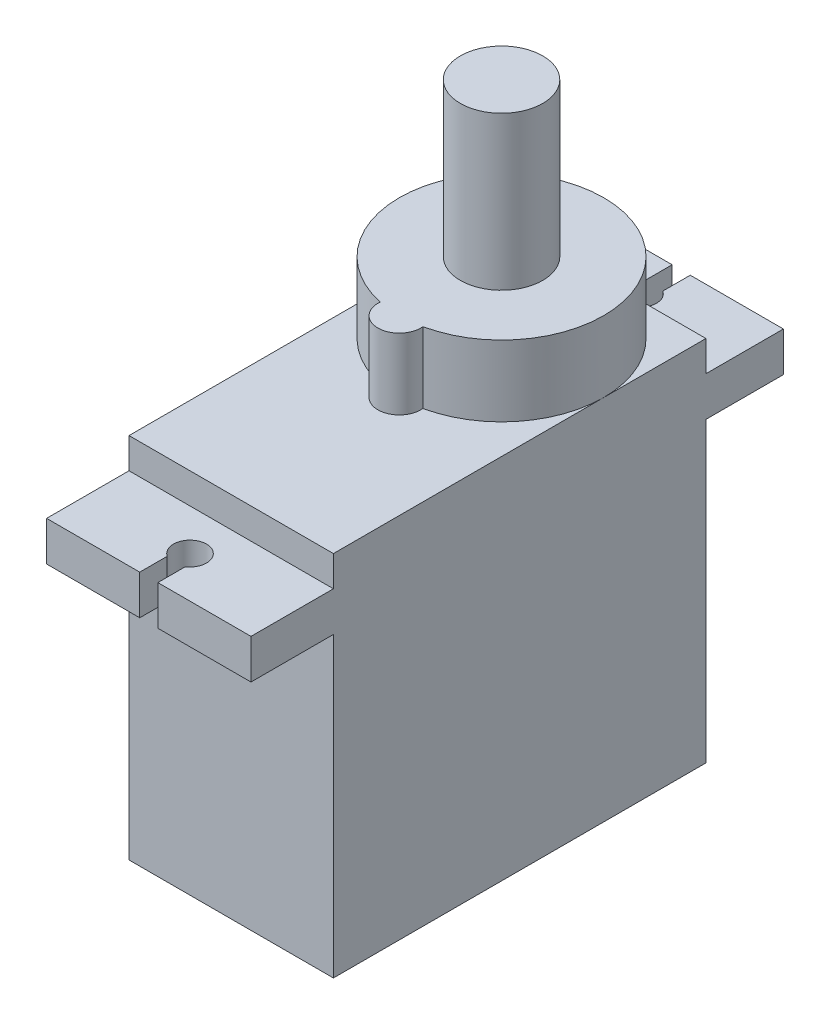
ISO-10303-21;
HEADER;
FILE_DESCRIPTION(('STEP AP214'),'2;1');
FILE_NAME('part.step','',(''),(''),'','','');
FILE_SCHEMA(('AUTOMOTIVE_DESIGN { 1 0 10303 214 1 1 1 1 }'));
ENDSEC;
DATA;
#1=APPLICATION_CONTEXT('core data for automotive mechanical design processes');
#2=APPLICATION_PROTOCOL_DEFINITION('international standard','automotive_design',2000,#1);
#3=PRODUCT_CONTEXT('',#1,'mechanical');
#4=PRODUCT('Part','Part','',(#3));
#5=PRODUCT_RELATED_PRODUCT_CATEGORY('part','',(#4));
#6=PRODUCT_DEFINITION_FORMATION('','',#4);
#7=PRODUCT_DEFINITION_CONTEXT('part definition',#1,'design');
#8=PRODUCT_DEFINITION('design','',#6,#7);
#9=PRODUCT_DEFINITION_SHAPE('','',#8);
#10=(LENGTH_UNIT() NAMED_UNIT(*) SI_UNIT(.MILLI.,.METRE.));
#11=(NAMED_UNIT(*) PLANE_ANGLE_UNIT() SI_UNIT($,.RADIAN.));
#12=(NAMED_UNIT(*) SI_UNIT($,.STERADIAN.) SOLID_ANGLE_UNIT());
#13=UNCERTAINTY_MEASURE_WITH_UNIT(LENGTH_MEASURE(1.E-05),#10,'distance_accuracy_value','');
#14=(GEOMETRIC_REPRESENTATION_CONTEXT(3) GLOBAL_UNCERTAINTY_ASSIGNED_CONTEXT((#13)) GLOBAL_UNIT_ASSIGNED_CONTEXT((#10,
#11,#12)) REPRESENTATION_CONTEXT('',''));
#15=CARTESIAN_POINT('',(0.,0.,0.));
#16=DIRECTION('',(0.,0.,1.));
#17=DIRECTION('',(1.,0.,0.));
#18=AXIS2_PLACEMENT_3D('',#15,#16,#17);
#19=CARTESIAN_POINT('',(0.,0.,0.));
#20=DIRECTION('',(0.,0.,-1.));
#21=DIRECTION('',(-1.,0.,0.));
#22=AXIS2_PLACEMENT_3D('',#19,#20,#21);
#23=PLANE('',#22);
#24=DIRECTION('',(0.,1.,0.));
#25=VECTOR('',#24,1.);
#26=CARTESIAN_POINT('',(6.2,-11.15,0.));
#27=LINE('',#26,#25);
#28=CARTESIAN_POINT('',(6.19999999999999,9.3,0.));
#29=VERTEX_POINT('',#28);
#30=CARTESIAN_POINT('',(6.2,11.15,0.));
#31=VERTEX_POINT('',#30);
#32=EDGE_CURVE('E397',#29,#31,#27,.T.);
#33=ORIENTED_EDGE('',*,*,#32,.F.);
#34=DIRECTION('',(-1.,0.,0.));
#35=VECTOR('',#34,1.);
#36=CARTESIAN_POINT('',(0.,9.3,0.));
#37=LINE('',#36,#35);
#38=CARTESIAN_POINT('',(-6.2,9.3,0.));
#39=VERTEX_POINT('',#38);
#40=EDGE_CURVE('E50',#29,#39,#37,.T.);
#41=ORIENTED_EDGE('',*,*,#40,.T.);
#42=DIRECTION('',(0.,-1.,0.));
#43=VECTOR('',#42,1.);
#44=CARTESIAN_POINT('',(-6.2,-11.15,0.));
#45=LINE('',#44,#43);
#46=CARTESIAN_POINT('',(-6.2,11.15,0.));
#47=VERTEX_POINT('',#46);
#48=EDGE_CURVE('E425',#47,#39,#45,.T.);
#49=ORIENTED_EDGE('',*,*,#48,.F.);
#50=DIRECTION('',(-1.,0.,0.));
#51=VECTOR('',#50,1.);
#52=CARTESIAN_POINT('',(-6.2,11.15,0.));
#53=LINE('',#52,#51);
#54=CARTESIAN_POINT('',(0.,11.15,0.));
#55=VERTEX_POINT('',#54);
#56=EDGE_CURVE('E419',#55,#47,#53,.T.);
#57=ORIENTED_EDGE('',*,*,#56,.F.);
#58=EDGE_CURVE('E420',#31,#55,#53,.T.);
#59=ORIENTED_EDGE('',*,*,#58,.F.);
#60=EDGE_LOOP('',(#33,#41,#49,#57,#59));
#61=FACE_BOUND('',#60,.T.);
#62=ADVANCED_FACE('F41',(#61),#23,.T.);
#63=CARTESIAN_POINT('',(0.,0.,22.6));
#64=DIRECTION('',(0.,0.,-1.));
#65=DIRECTION('',(-1.,0.,0.));
#66=AXIS2_PLACEMENT_3D('',#63,#64,#65);
#67=PLANE('',#66);
#68=DIRECTION('',(-1.,0.,0.));
#69=VECTOR('',#68,1.);
#70=CARTESIAN_POINT('',(6.2,9.3,22.6));
#71=LINE('',#70,#69);
#72=CARTESIAN_POINT('',(6.2,9.3,22.6));
#73=VERTEX_POINT('',#72);
#74=CARTESIAN_POINT('',(-6.2,9.3,22.6));
#75=VERTEX_POINT('',#74);
#76=EDGE_CURVE('E320',#73,#75,#71,.T.);
#77=ORIENTED_EDGE('',*,*,#76,.F.);
#78=DIRECTION('',(0.,1.,0.));
#79=VECTOR('',#78,1.);
#80=CARTESIAN_POINT('',(6.2,-11.15,22.6));
#81=LINE('',#80,#79);
#82=CARTESIAN_POINT('',(6.2,11.15,22.6));
#83=VERTEX_POINT('',#82);
#84=EDGE_CURVE('E403',#73,#83,#81,.T.);
#85=ORIENTED_EDGE('',*,*,#84,.T.);
#86=DIRECTION('',(-1.,0.,0.));
#87=VECTOR('',#86,1.);
#88=CARTESIAN_POINT('',(-6.2,11.15,22.6));
#89=LINE('',#88,#87);
#90=CARTESIAN_POINT('',(-6.2,11.15,22.6));
#91=VERTEX_POINT('',#90);
#92=EDGE_CURVE('E402',#83,#91,#89,.T.);
#93=ORIENTED_EDGE('',*,*,#92,.T.);
#94=DIRECTION('',(0.,-1.,0.));
#95=VECTOR('',#94,1.);
#96=CARTESIAN_POINT('',(-6.2,-11.15,22.6));
#97=LINE('',#96,#95);
#98=EDGE_CURVE('E407',#91,#75,#97,.T.);
#99=ORIENTED_EDGE('',*,*,#98,.T.);
#100=EDGE_LOOP('',(#77,#85,#93,#99));
#101=FACE_BOUND('',#100,.T.);
#102=ADVANCED_FACE('F507',(#101),#67,.F.);
#103=CARTESIAN_POINT('',(-6.2,11.15,22.6));
#104=DIRECTION('',(0.,-1.,0.));
#105=DIRECTION('',(0.,0.,-1.));
#106=AXIS2_PLACEMENT_3D('',#103,#104,#105);
#107=PLANE('',#106);
#108=CARTESIAN_POINT('',(0.,11.15,12.4));
#109=DIRECTION('',(0.,1.,0.));
#110=DIRECTION('',(0.,0.,1.));
#111=AXIS2_PLACEMENT_3D('',#108,#109,#110);
#112=CIRCLE('',#111,1.3);
#113=CARTESIAN_POINT('',(-1.29283600969762,11.15,12.2637096774194));
#114=VERTEX_POINT('',#113);
#115=CARTESIAN_POINT('',(1.29283600969762,11.15,12.2637096774194));
#116=VERTEX_POINT('',#115);
#117=EDGE_CURVE('E368',#114,#116,#112,.T.);
#118=ORIENTED_EDGE('',*,*,#117,.F.);
#119=CARTESIAN_POINT('',(0.,11.15,6.2));
#120=DIRECTION('',(0.,1.,0.));
#121=DIRECTION('',(0.,0.,1.));
#122=AXIS2_PLACEMENT_3D('',#119,#120,#121);
#123=CIRCLE('',#122,6.2);
#124=CARTESIAN_POINT('',(-6.2,11.15,6.2));
#125=VERTEX_POINT('',#124);
#126=EDGE_CURVE('E389',#125,#114,#123,.T.);
#127=ORIENTED_EDGE('',*,*,#126,.F.);
#128=DIRECTION('',(0.,0.,-1.));
#129=VECTOR('',#128,1.);
#130=CARTESIAN_POINT('',(-6.2,11.15,22.6));
#131=LINE('',#130,#129);
#132=EDGE_CURVE('E440',#91,#125,#131,.T.);
#133=ORIENTED_EDGE('',*,*,#132,.F.);
#134=ORIENTED_EDGE('',*,*,#92,.F.);
#135=DIRECTION('',(0.,0.,-1.));
#136=VECTOR('',#135,1.);
#137=CARTESIAN_POINT('',(6.2,11.15,22.6));
#138=LINE('',#137,#136);
#139=CARTESIAN_POINT('',(6.2,11.15,6.2));
#140=VERTEX_POINT('',#139);
#141=EDGE_CURVE('E445',#83,#140,#138,.T.);
#142=ORIENTED_EDGE('',*,*,#141,.T.);
#143=EDGE_CURVE('E379',#116,#140,#123,.T.);
#144=ORIENTED_EDGE('',*,*,#143,.F.);
#145=EDGE_LOOP('',(#118,#127,#133,#134,#142,#144));
#146=FACE_BOUND('',#145,.T.);
#147=ADVANCED_FACE('F510',(#146),#107,.F.);
#148=EDGE_CURVE('E373',#140,#55,#123,.T.);
#149=ORIENTED_EDGE('',*,*,#148,.F.);
#150=EDGE_CURVE('E444',#140,#31,#138,.T.);
#151=ORIENTED_EDGE('',*,*,#150,.T.);
#152=ORIENTED_EDGE('',*,*,#58,.T.);
#153=EDGE_LOOP('',(#149,#151,#152));
#154=FACE_BOUND('',#153,.T.);
#155=ADVANCED_FACE('F474',(#154),#107,.F.);
#156=CARTESIAN_POINT('',(6.2,-11.15,22.6));
#157=DIRECTION('',(-1.,0.,0.));
#158=DIRECTION('',(0.,0.,1.));
#159=AXIS2_PLACEMENT_3D('',#156,#157,#158);
#160=PLANE('',#159);
#161=CARTESIAN_POINT('',(6.2,-11.15,0.));
#162=VERTEX_POINT('',#161);
#163=CARTESIAN_POINT('',(6.19999999999999,6.9,0.));
#164=VERTEX_POINT('',#163);
#165=EDGE_CURVE('E415',#162,#164,#27,.T.);
#166=ORIENTED_EDGE('',*,*,#165,.T.);
#167=DIRECTION('',(0.,0.,-1.));
#168=VECTOR('',#167,1.);
#169=CARTESIAN_POINT('',(6.19999999999999,6.9,0.300000000000005));
#170=LINE('',#169,#168);
#171=CARTESIAN_POINT('',(6.19999999999999,6.9,-4.69999999999999));
#172=VERTEX_POINT('',#171);
#173=EDGE_CURVE('E246',#164,#172,#170,.T.);
#174=ORIENTED_EDGE('',*,*,#173,.T.);
#175=DIRECTION('',(0.,1.,0.));
#176=VECTOR('',#175,1.);
#177=CARTESIAN_POINT('',(6.19999999999999,6.9,-4.69999999999999));
#178=LINE('',#177,#176);
#179=CARTESIAN_POINT('',(6.19999999999999,9.3,-4.69999999999999));
#180=VERTEX_POINT('',#179);
#181=EDGE_CURVE('E278',#172,#180,#178,.T.);
#182=ORIENTED_EDGE('',*,*,#181,.T.);
#183=DIRECTION('',(0.,0.,-1.));
#184=VECTOR('',#183,1.);
#185=CARTESIAN_POINT('',(6.19999999999999,9.3,0.300000000000005));
#186=LINE('',#185,#184);
#187=EDGE_CURVE('E266',#29,#180,#186,.T.);
#188=ORIENTED_EDGE('',*,*,#187,.F.);
#189=ORIENTED_EDGE('',*,*,#32,.T.);
#190=ORIENTED_EDGE('',*,*,#150,.F.);
#191=ORIENTED_EDGE('',*,*,#141,.F.);
#192=ORIENTED_EDGE('',*,*,#84,.F.);
#193=DIRECTION('',(0.,0.,-1.));
#194=VECTOR('',#193,1.);
#195=CARTESIAN_POINT('',(6.2,9.3,22.6));
#196=LINE('',#195,#194);
#197=CARTESIAN_POINT('',(6.2,9.3,27.6));
#198=VERTEX_POINT('',#197);
#199=EDGE_CURVE('E274',#198,#73,#196,.T.);
#200=ORIENTED_EDGE('',*,*,#199,.F.);
#201=DIRECTION('',(0.,1.,0.));
#202=VECTOR('',#201,1.);
#203=CARTESIAN_POINT('',(6.2,6.9,27.6));
#204=LINE('',#203,#202);
#205=CARTESIAN_POINT('',(6.2,6.9,27.6));
#206=VERTEX_POINT('',#205);
#207=EDGE_CURVE('E347',#206,#198,#204,.T.);
#208=ORIENTED_EDGE('',*,*,#207,.F.);
#209=DIRECTION('',(0.,0.,-1.));
#210=VECTOR('',#209,1.);
#211=CARTESIAN_POINT('',(6.2,6.9,22.6));
#212=LINE('',#211,#210);
#213=CARTESIAN_POINT('',(6.2,6.9,22.6));
#214=VERTEX_POINT('',#213);
#215=EDGE_CURVE('E287',#206,#214,#212,.T.);
#216=ORIENTED_EDGE('',*,*,#215,.T.);
#217=CARTESIAN_POINT('',(6.2,-11.15,22.6));
#218=VERTEX_POINT('',#217);
#219=EDGE_CURVE('E398',#218,#214,#81,.T.);
#220=ORIENTED_EDGE('',*,*,#219,.F.);
#221=DIRECTION('',(0.,0.,-1.));
#222=VECTOR('',#221,1.);
#223=CARTESIAN_POINT('',(6.2,-11.15,22.6));
#224=LINE('',#223,#222);
#225=EDGE_CURVE('E414',#218,#162,#224,.T.);
#226=ORIENTED_EDGE('',*,*,#225,.T.);
#227=EDGE_LOOP('',(#166,#174,#182,#188,#189,#190,#191,#192,#200,#208,#216,#220,#226));
#228=FACE_BOUND('',#227,.T.);
#229=ADVANCED_FACE('F43',(#228),#160,.F.);
#230=EDGE_CURVE('E465',#55,#125,#123,.T.);
#231=ORIENTED_EDGE('',*,*,#230,.F.);
#232=ORIENTED_EDGE('',*,*,#56,.T.);
#233=EDGE_CURVE('E439',#125,#47,#131,.T.);
#234=ORIENTED_EDGE('',*,*,#233,.F.);
#235=EDGE_LOOP('',(#231,#232,#234));
#236=FACE_BOUND('',#235,.T.);
#237=ADVANCED_FACE('F464',(#236),#107,.F.);
#238=CARTESIAN_POINT('',(-6.2,-11.15,22.6));
#239=DIRECTION('',(1.,0.,0.));
#240=DIRECTION('',(0.,0.,-1.));
#241=AXIS2_PLACEMENT_3D('',#238,#239,#240);
#242=PLANE('',#241);
#243=DIRECTION('',(0.,0.,1.));
#244=VECTOR('',#243,1.);
#245=CARTESIAN_POINT('',(-6.2,6.9,-4.69999999999999));
#246=LINE('',#245,#244);
#247=CARTESIAN_POINT('',(-6.2,6.9,-4.69999999999999));
#248=VERTEX_POINT('',#247);
#249=CARTESIAN_POINT('',(-6.2,6.9,0.));
#250=VERTEX_POINT('',#249);
#251=EDGE_CURVE('E242',#248,#250,#246,.T.);
#252=ORIENTED_EDGE('',*,*,#251,.T.);
#253=CARTESIAN_POINT('',(-6.2,-11.15,0.));
#254=VERTEX_POINT('',#253);
#255=EDGE_CURVE('E424',#250,#254,#45,.T.);
#256=ORIENTED_EDGE('',*,*,#255,.T.);
#257=DIRECTION('',(0.,0.,-1.));
#258=VECTOR('',#257,1.);
#259=CARTESIAN_POINT('',(-6.2,-11.15,22.6));
#260=LINE('',#259,#258);
#261=CARTESIAN_POINT('',(-6.2,-11.15,22.6));
#262=VERTEX_POINT('',#261);
#263=EDGE_CURVE('E435',#262,#254,#260,.T.);
#264=ORIENTED_EDGE('',*,*,#263,.F.);
#265=CARTESIAN_POINT('',(-6.2,6.9,22.6));
#266=VERTEX_POINT('',#265);
#267=EDGE_CURVE('E406',#266,#262,#97,.T.);
#268=ORIENTED_EDGE('',*,*,#267,.F.);
#269=DIRECTION('',(0.,0.,1.));
#270=VECTOR('',#269,1.);
#271=CARTESIAN_POINT('',(-6.2,6.9,27.6));
#272=LINE('',#271,#270);
#273=CARTESIAN_POINT('',(-6.2,6.9,27.6));
#274=VERTEX_POINT('',#273);
#275=EDGE_CURVE('E65',#266,#274,#272,.T.);
#276=ORIENTED_EDGE('',*,*,#275,.T.);
#277=DIRECTION('',(0.,1.,0.));
#278=VECTOR('',#277,1.);
#279=CARTESIAN_POINT('',(-6.2,6.9,27.6));
#280=LINE('',#279,#278);
#281=CARTESIAN_POINT('',(-6.2,9.3,27.6));
#282=VERTEX_POINT('',#281);
#283=EDGE_CURVE('E317',#274,#282,#280,.T.);
#284=ORIENTED_EDGE('',*,*,#283,.T.);
#285=DIRECTION('',(0.,0.,1.));
#286=VECTOR('',#285,1.);
#287=CARTESIAN_POINT('',(-6.2,9.3,27.6));
#288=LINE('',#287,#286);
#289=EDGE_CURVE('E324',#75,#282,#288,.T.);
#290=ORIENTED_EDGE('',*,*,#289,.F.);
#291=ORIENTED_EDGE('',*,*,#98,.F.);
#292=ORIENTED_EDGE('',*,*,#132,.T.);
#293=ORIENTED_EDGE('',*,*,#233,.T.);
#294=ORIENTED_EDGE('',*,*,#48,.T.);
#295=DIRECTION('',(0.,0.,1.));
#296=VECTOR('',#295,1.);
#297=CARTESIAN_POINT('',(-6.2,9.3,-4.69999999999999));
#298=LINE('',#297,#296);
#299=CARTESIAN_POINT('',(-6.2,9.3,-4.69999999999999));
#300=VERTEX_POINT('',#299);
#301=EDGE_CURVE('E57',#300,#39,#298,.T.);
#302=ORIENTED_EDGE('',*,*,#301,.F.);
#303=DIRECTION('',(0.,1.,0.));
#304=VECTOR('',#303,1.);
#305=CARTESIAN_POINT('',(-6.2,6.9,-4.69999999999999));
#306=LINE('',#305,#304);
#307=EDGE_CURVE('E282',#248,#300,#306,.T.);
#308=ORIENTED_EDGE('',*,*,#307,.F.);
#309=EDGE_LOOP('',(#252,#256,#264,#268,#276,#284,#290,#291,#292,#293,#294,#302,#308));
#310=FACE_BOUND('',#309,.T.);
#311=ADVANCED_FACE('F456',(#310),#242,.F.);
#312=CARTESIAN_POINT('',(-6.2,-11.15,22.6));
#313=DIRECTION('',(0.,1.,0.));
#314=DIRECTION('',(0.,0.,1.));
#315=AXIS2_PLACEMENT_3D('',#312,#313,#314);
#316=PLANE('',#315);
#317=DIRECTION('',(1.,0.,0.));
#318=VECTOR('',#317,1.);
#319=CARTESIAN_POINT('',(-6.2,-11.15,0.));
#320=LINE('',#319,#318);
#321=EDGE_CURVE('E429',#254,#162,#320,.T.);
#322=ORIENTED_EDGE('',*,*,#321,.T.);
#323=ORIENTED_EDGE('',*,*,#225,.F.);
#324=DIRECTION('',(1.,0.,0.));
#325=VECTOR('',#324,1.);
#326=CARTESIAN_POINT('',(-6.2,-11.15,22.6));
#327=LINE('',#326,#325);
#328=EDGE_CURVE('E411',#262,#218,#327,.T.);
#329=ORIENTED_EDGE('',*,*,#328,.F.);
#330=ORIENTED_EDGE('',*,*,#263,.T.);
#331=EDGE_LOOP('',(#322,#323,#329,#330));
#332=FACE_BOUND('',#331,.T.);
#333=ADVANCED_FACE('F488',(#332),#316,.F.);
#334=ORIENTED_EDGE('',*,*,#219,.T.);
#335=DIRECTION('',(-1.,0.,0.));
#336=VECTOR('',#335,1.);
#337=CARTESIAN_POINT('',(6.2,6.9,22.6));
#338=LINE('',#337,#336);
#339=EDGE_CURVE('E291',#214,#266,#338,.T.);
#340=ORIENTED_EDGE('',*,*,#339,.T.);
#341=ORIENTED_EDGE('',*,*,#267,.T.);
#342=ORIENTED_EDGE('',*,*,#328,.T.);
#343=EDGE_LOOP('',(#334,#340,#341,#342));
#344=FACE_BOUND('',#343,.T.);
#345=ADVANCED_FACE('F496',(#344),#67,.F.);
#346=CARTESIAN_POINT('',(-1.21,-6.65,0.));
#347=DIRECTION('',(0.,0.,-1.));
#348=DIRECTION('',(-1.,0.,0.));
#349=AXIS2_PLACEMENT_3D('',#346,#347,#348);
#350=CIRCLE('',#349,0.6);
#351=CARTESIAN_POINT('',(-1.81,-6.65,0.));
#352=VERTEX_POINT('',#351);
#353=EDGE_CURVE('E561',#352,#352,#350,.T.);
#354=ORIENTED_EDGE('',*,*,#353,.F.);
#355=EDGE_LOOP('',(#354));
#356=FACE_BOUND('',#355,.T.);
#357=CARTESIAN_POINT('',(1.21,-6.65,0.));
#358=DIRECTION('',(0.,0.,-1.));
#359=DIRECTION('',(-1.,0.,0.));
#360=AXIS2_PLACEMENT_3D('',#357,#358,#359);
#361=CIRCLE('',#360,0.6);
#362=CARTESIAN_POINT('',(0.61,-6.65,0.));
#363=VERTEX_POINT('',#362);
#364=EDGE_CURVE('E565',#363,#363,#361,.T.);
#365=ORIENTED_EDGE('',*,*,#364,.F.);
#366=EDGE_LOOP('',(#365));
#367=FACE_BOUND('',#366,.T.);
#368=CARTESIAN_POINT('',(0.,-6.65,0.));
#369=DIRECTION('',(0.,0.,-1.));
#370=DIRECTION('',(-1.,0.,0.));
#371=AXIS2_PLACEMENT_3D('',#368,#369,#370);
#372=CIRCLE('',#371,0.6);
#373=CARTESIAN_POINT('',(-0.6,-6.65,0.));
#374=VERTEX_POINT('',#373);
#375=EDGE_CURVE('E237',#374,#374,#372,.T.);
#376=ORIENTED_EDGE('',*,*,#375,.F.);
#377=EDGE_LOOP('',(#376));
#378=FACE_BOUND('',#377,.T.);
#379=DIRECTION('',(-1.,0.,0.));
#380=VECTOR('',#379,1.);
#381=CARTESIAN_POINT('',(0.,6.9,0.));
#382=LINE('',#381,#380);
#383=EDGE_CURVE('E11',#164,#250,#382,.T.);
#384=ORIENTED_EDGE('',*,*,#383,.F.);
#385=ORIENTED_EDGE('',*,*,#165,.F.);
#386=ORIENTED_EDGE('',*,*,#321,.F.);
#387=ORIENTED_EDGE('',*,*,#255,.F.);
#388=EDGE_LOOP('',(#384,#385,#386,#387));
#389=FACE_BOUND('',#388,.T.);
#390=ADVANCED_FACE('F491',(#356,#367,#378,#389),#23,.T.);
#391=CARTESIAN_POINT('',(0.,15.45,12.4));
#392=DIRECTION('',(0.,-1.,0.));
#393=DIRECTION('',(0.,0.,-1.));
#394=AXIS2_PLACEMENT_3D('',#391,#392,#393);
#395=CYLINDRICAL_SURFACE('',#394,1.3);
#396=ORIENTED_EDGE('',*,*,#117,.T.);
#397=DIRECTION('',(0.,-1.,0.));
#398=VECTOR('',#397,1.);
#399=CARTESIAN_POINT('',(1.29283600969762,15.45,12.2637096774194));
#400=LINE('',#399,#398);
#401=CARTESIAN_POINT('',(1.29283600969762,15.45,12.2637096774194));
#402=VERTEX_POINT('',#401);
#403=EDGE_CURVE('E393',#402,#116,#400,.T.);
#404=ORIENTED_EDGE('',*,*,#403,.F.);
#405=CARTESIAN_POINT('',(0.,15.45,12.4));
#406=DIRECTION('',(0.,1.,0.));
#407=DIRECTION('',(0.,0.,1.));
#408=AXIS2_PLACEMENT_3D('',#405,#406,#407);
#409=CIRCLE('',#408,1.3);
#410=CARTESIAN_POINT('',(-1.29283600969762,15.45,12.2637096774194));
#411=VERTEX_POINT('',#410);
#412=EDGE_CURVE('E374',#411,#402,#409,.T.);
#413=ORIENTED_EDGE('',*,*,#412,.F.);
#414=DIRECTION('',(0.,-1.,0.));
#415=VECTOR('',#414,1.);
#416=CARTESIAN_POINT('',(-1.29283600969762,15.45,12.2637096774194));
#417=LINE('',#416,#415);
#418=EDGE_CURVE('E382',#411,#114,#417,.T.);
#419=ORIENTED_EDGE('',*,*,#418,.T.);
#420=EDGE_LOOP('',(#396,#404,#413,#419));
#421=FACE_BOUND('',#420,.T.);
#422=ADVANCED_FACE('F550',(#421),#395,.T.);
#423=CARTESIAN_POINT('',(0.,15.45,6.2));
#424=DIRECTION('',(0.,-1.,0.));
#425=DIRECTION('',(0.,0.,-1.));
#426=AXIS2_PLACEMENT_3D('',#423,#424,#425);
#427=CYLINDRICAL_SURFACE('',#426,6.2);
#428=ORIENTED_EDGE('',*,*,#143,.T.);
#429=ORIENTED_EDGE('',*,*,#148,.T.);
#430=ORIENTED_EDGE('',*,*,#230,.T.);
#431=ORIENTED_EDGE('',*,*,#126,.T.);
#432=ORIENTED_EDGE('',*,*,#418,.F.);
#433=CARTESIAN_POINT('',(0.,15.45,6.2));
#434=DIRECTION('',(0.,1.,0.));
#435=DIRECTION('',(0.,0.,1.));
#436=AXIS2_PLACEMENT_3D('',#433,#434,#435);
#437=CIRCLE('',#436,6.2);
#438=EDGE_CURVE('E378',#402,#411,#437,.T.);
#439=ORIENTED_EDGE('',*,*,#438,.F.);
#440=ORIENTED_EDGE('',*,*,#403,.T.);
#441=EDGE_LOOP('',(#428,#429,#430,#431,#432,#439,#440));
#442=FACE_BOUND('',#441,.T.);
#443=ADVANCED_FACE('F516',(#442),#427,.T.);
#444=CARTESIAN_POINT('',(0.,15.45,9.3));
#445=DIRECTION('',(0.,1.,0.));
#446=DIRECTION('',(0.,0.,1.));
#447=AXIS2_PLACEMENT_3D('',#444,#445,#446);
#448=PLANE('',#447);
#449=CARTESIAN_POINT('',(0.,15.45,6.2));
#450=DIRECTION('',(0.,1.,0.));
#451=DIRECTION('',(0.,0.,1.));
#452=AXIS2_PLACEMENT_3D('',#449,#450,#451);
#453=CIRCLE('',#452,2.5);
#454=CARTESIAN_POINT('',(0.,15.45,8.7));
#455=VERTEX_POINT('',#454);
#456=EDGE_CURVE('E369',#455,#455,#453,.T.);
#457=ORIENTED_EDGE('',*,*,#456,.F.);
#458=EDGE_LOOP('',(#457));
#459=FACE_BOUND('',#458,.T.);
#460=ORIENTED_EDGE('',*,*,#412,.T.);
#461=ORIENTED_EDGE('',*,*,#438,.T.);
#462=EDGE_LOOP('',(#460,#461));
#463=FACE_BOUND('',#462,.T.);
#464=ADVANCED_FACE('F788',(#459,#463),#448,.T.);
#465=CARTESIAN_POINT('',(0.,24.75,6.2));
#466=DIRECTION('',(0.,-1.,0.));
#467=DIRECTION('',(0.,0.,-1.));
#468=AXIS2_PLACEMENT_3D('',#465,#466,#467);
#469=CYLINDRICAL_SURFACE('',#468,2.5);
#470=CARTESIAN_POINT('',(0.,24.75,6.2));
#471=DIRECTION('',(0.,1.,0.));
#472=DIRECTION('',(0.,0.,1.));
#473=AXIS2_PLACEMENT_3D('',#470,#471,#472);
#474=CIRCLE('',#473,2.5);
#475=CARTESIAN_POINT('',(0.,24.75,8.7));
#476=VERTEX_POINT('',#475);
#477=EDGE_CURVE('E350',#476,#476,#474,.T.);
#478=ORIENTED_EDGE('',*,*,#477,.F.);
#479=EDGE_LOOP('',(#478));
#480=FACE_BOUND('',#479,.T.);
#481=ORIENTED_EDGE('',*,*,#456,.T.);
#482=EDGE_LOOP('',(#481));
#483=FACE_BOUND('',#482,.T.);
#484=ADVANCED_FACE('F796',(#480,#483),#469,.T.);
#485=CARTESIAN_POINT('',(0.,24.75,6.2));
#486=DIRECTION('',(0.,1.,0.));
#487=DIRECTION('',(0.,0.,1.));
#488=AXIS2_PLACEMENT_3D('',#485,#486,#487);
#489=PLANE('',#488);
#490=ORIENTED_EDGE('',*,*,#477,.T.);
#491=EDGE_LOOP('',(#490));
#492=FACE_BOUND('',#491,.T.);
#493=ADVANCED_FACE('F641',(#492),#489,.T.);
#494=CARTESIAN_POINT('',(6.2,6.9,27.6));
#495=DIRECTION('',(0.,0.,1.));
#496=DIRECTION('',(1.,0.,0.));
#497=AXIS2_PLACEMENT_3D('',#494,#495,#496);
#498=PLANE('',#497);
#499=DIRECTION('',(1.,0.,0.));
#500=VECTOR('',#499,1.);
#501=CARTESIAN_POINT('',(6.2,9.3,27.6));
#502=LINE('',#501,#500);
#503=CARTESIAN_POINT('',(0.550000000000004,9.3,27.6));
#504=VERTEX_POINT('',#503);
#505=EDGE_CURVE('E292',#504,#198,#502,.T.);
#506=ORIENTED_EDGE('',*,*,#505,.F.);
#507=DIRECTION('',(0.,1.,0.));
#508=VECTOR('',#507,1.);
#509=CARTESIAN_POINT('',(0.550000000000004,6.9,27.6));
#510=LINE('',#509,#508);
#511=CARTESIAN_POINT('',(0.550000000000004,6.9,27.6));
#512=VERTEX_POINT('',#511);
#513=EDGE_CURVE('E351',#512,#504,#510,.T.);
#514=ORIENTED_EDGE('',*,*,#513,.F.);
#515=DIRECTION('',(1.,0.,0.));
#516=VECTOR('',#515,1.);
#517=CARTESIAN_POINT('',(6.2,6.9,27.6));
#518=LINE('',#517,#516);
#519=EDGE_CURVE('E313',#512,#206,#518,.T.);
#520=ORIENTED_EDGE('',*,*,#519,.T.);
#521=ORIENTED_EDGE('',*,*,#207,.T.);
#522=EDGE_LOOP('',(#506,#514,#520,#521));
#523=FACE_BOUND('',#522,.T.);
#524=ADVANCED_FACE('F521',(#523),#498,.T.);
#525=CARTESIAN_POINT('',(0.549999999999997,6.9,25.9351646544245));
#526=DIRECTION('',(-1.,0.,0.));
#527=DIRECTION('',(0.,0.,1.));
#528=AXIS2_PLACEMENT_3D('',#525,#526,#527);
#529=PLANE('',#528);
#530=DIRECTION('',(0.,0.,1.));
#531=VECTOR('',#530,1.);
#532=CARTESIAN_POINT('',(0.549999999999997,9.3,25.9351646544245));
#533=LINE('',#532,#531);
#534=CARTESIAN_POINT('',(0.549999999999997,9.3,25.9351646544245));
#535=VERTEX_POINT('',#534);
#536=EDGE_CURVE('E340',#535,#504,#533,.T.);
#537=ORIENTED_EDGE('',*,*,#536,.F.);
#538=DIRECTION('',(0.,1.,0.));
#539=VECTOR('',#538,1.);
#540=CARTESIAN_POINT('',(0.549999999999997,6.9,25.9351646544245));
#541=LINE('',#540,#539);
#542=CARTESIAN_POINT('',(0.549999999999997,6.9,25.9351646544245));
#543=VERTEX_POINT('',#542);
#544=EDGE_CURVE('E354',#543,#535,#541,.T.);
#545=ORIENTED_EDGE('',*,*,#544,.F.);
#546=DIRECTION('',(0.,0.,1.));
#547=VECTOR('',#546,1.);
#548=CARTESIAN_POINT('',(0.549999999999997,6.9,25.9351646544245));
#549=LINE('',#548,#547);
#550=EDGE_CURVE('E309',#543,#512,#549,.T.);
#551=ORIENTED_EDGE('',*,*,#550,.T.);
#552=ORIENTED_EDGE('',*,*,#513,.T.);
#553=EDGE_LOOP('',(#537,#545,#551,#552));
#554=FACE_BOUND('',#553,.T.);
#555=ADVANCED_FACE('F540',(#554),#529,.T.);
#556=CARTESIAN_POINT('',(0.,6.9,25.1));
#557=DIRECTION('',(0.,1.,0.));
#558=DIRECTION('',(0.,0.,1.));
#559=AXIS2_PLACEMENT_3D('',#556,#557,#558);
#560=CYLINDRICAL_SURFACE('',#559,0.999999999999999);
#561=CARTESIAN_POINT('',(0.,9.3,25.1));
#562=DIRECTION('',(0.,-1.,0.));
#563=DIRECTION('',(0.,0.,1.));
#564=AXIS2_PLACEMENT_3D('',#561,#562,#563);
#565=CIRCLE('',#564,0.999999999999999);
#566=CARTESIAN_POINT('',(-0.550000000000002,9.3,25.9351646544245));
#567=VERTEX_POINT('',#566);
#568=EDGE_CURVE('E336',#567,#535,#565,.T.);
#569=ORIENTED_EDGE('',*,*,#568,.F.);
#570=DIRECTION('',(0.,1.,0.));
#571=VECTOR('',#570,1.);
#572=CARTESIAN_POINT('',(-0.550000000000002,6.9,25.9351646544245));
#573=LINE('',#572,#571);
#574=CARTESIAN_POINT('',(-0.550000000000002,6.9,25.9351646544245));
#575=VERTEX_POINT('',#574);
#576=EDGE_CURVE('E357',#575,#567,#573,.T.);
#577=ORIENTED_EDGE('',*,*,#576,.F.);
#578=CARTESIAN_POINT('',(0.,6.9,25.1));
#579=DIRECTION('',(0.,-1.,0.));
#580=DIRECTION('',(0.,0.,1.));
#581=AXIS2_PLACEMENT_3D('',#578,#579,#580);
#582=CIRCLE('',#581,0.999999999999999);
#583=EDGE_CURVE('E305',#575,#543,#582,.T.);
#584=ORIENTED_EDGE('',*,*,#583,.T.);
#585=ORIENTED_EDGE('',*,*,#544,.T.);
#586=EDGE_LOOP('',(#569,#577,#584,#585));
#587=FACE_BOUND('',#586,.T.);
#588=ADVANCED_FACE('F530',(#587),#560,.F.);
#589=CARTESIAN_POINT('',(-0.550000000000002,6.9,25.9351646544245));
#590=DIRECTION('',(1.,0.,0.));
#591=DIRECTION('',(0.,0.,-1.));
#592=AXIS2_PLACEMENT_3D('',#589,#590,#591);
#593=PLANE('',#592);
#594=DIRECTION('',(0.,0.,-1.));
#595=VECTOR('',#594,1.);
#596=CARTESIAN_POINT('',(-0.550000000000002,9.3,25.9351646544245));
#597=LINE('',#596,#595);
#598=CARTESIAN_POINT('',(-0.55,9.3,27.6));
#599=VERTEX_POINT('',#598);
#600=EDGE_CURVE('E332',#599,#567,#597,.T.);
#601=ORIENTED_EDGE('',*,*,#600,.F.);
#602=DIRECTION('',(0.,1.,0.));
#603=VECTOR('',#602,1.);
#604=CARTESIAN_POINT('',(-0.55,6.9,27.6));
#605=LINE('',#604,#603);
#606=CARTESIAN_POINT('',(-0.55,6.9,27.6));
#607=VERTEX_POINT('',#606);
#608=EDGE_CURVE('E360',#607,#599,#605,.T.);
#609=ORIENTED_EDGE('',*,*,#608,.F.);
#610=DIRECTION('',(0.,0.,-1.));
#611=VECTOR('',#610,1.);
#612=CARTESIAN_POINT('',(-0.550000000000002,6.9,25.9351646544245));
#613=LINE('',#612,#611);
#614=EDGE_CURVE('E301',#607,#575,#613,.T.);
#615=ORIENTED_EDGE('',*,*,#614,.T.);
#616=ORIENTED_EDGE('',*,*,#576,.T.);
#617=EDGE_LOOP('',(#601,#609,#615,#616));
#618=FACE_BOUND('',#617,.T.);
#619=ADVANCED_FACE('F532',(#618),#593,.T.);
#620=CARTESIAN_POINT('',(-0.55,6.9,27.6));
#621=DIRECTION('',(0.,0.,1.));
#622=DIRECTION('',(1.,0.,0.));
#623=AXIS2_PLACEMENT_3D('',#620,#621,#622);
#624=PLANE('',#623);
#625=DIRECTION('',(1.,0.,0.));
#626=VECTOR('',#625,1.);
#627=CARTESIAN_POINT('',(-0.55,9.3,27.6));
#628=LINE('',#627,#626);
#629=EDGE_CURVE('E328',#282,#599,#628,.T.);
#630=ORIENTED_EDGE('',*,*,#629,.F.);
#631=ORIENTED_EDGE('',*,*,#283,.F.);
#632=DIRECTION('',(1.,0.,0.));
#633=VECTOR('',#632,1.);
#634=CARTESIAN_POINT('',(-0.55,6.9,27.6));
#635=LINE('',#634,#633);
#636=EDGE_CURVE('E297',#274,#607,#635,.T.);
#637=ORIENTED_EDGE('',*,*,#636,.T.);
#638=ORIENTED_EDGE('',*,*,#608,.T.);
#639=EDGE_LOOP('',(#630,#631,#637,#638));
#640=FACE_BOUND('',#639,.T.);
#641=ADVANCED_FACE('F499',(#640),#624,.T.);
#642=CARTESIAN_POINT('',(0.,6.9,25.1));
#643=DIRECTION('',(0.,1.,0.));
#644=DIRECTION('',(0.,0.,1.));
#645=AXIS2_PLACEMENT_3D('',#642,#643,#644);
#646=PLANE('',#645);
#647=ORIENTED_EDGE('',*,*,#215,.F.);
#648=ORIENTED_EDGE('',*,*,#519,.F.);
#649=ORIENTED_EDGE('',*,*,#550,.F.);
#650=ORIENTED_EDGE('',*,*,#583,.F.);
#651=ORIENTED_EDGE('',*,*,#614,.F.);
#652=ORIENTED_EDGE('',*,*,#636,.F.);
#653=ORIENTED_EDGE('',*,*,#275,.F.);
#654=ORIENTED_EDGE('',*,*,#339,.F.);
#655=EDGE_LOOP('',(#647,#648,#649,#650,#651,#652,#653,#654));
#656=FACE_BOUND('',#655,.T.);
#657=ADVANCED_FACE('F524',(#656),#646,.F.);
#658=CARTESIAN_POINT('',(0.,9.3,25.1));
#659=DIRECTION('',(0.,1.,0.));
#660=DIRECTION('',(0.,0.,1.));
#661=AXIS2_PLACEMENT_3D('',#658,#659,#660);
#662=PLANE('',#661);
#663=ORIENTED_EDGE('',*,*,#199,.T.);
#664=ORIENTED_EDGE('',*,*,#76,.T.);
#665=ORIENTED_EDGE('',*,*,#289,.T.);
#666=ORIENTED_EDGE('',*,*,#629,.T.);
#667=ORIENTED_EDGE('',*,*,#600,.T.);
#668=ORIENTED_EDGE('',*,*,#568,.T.);
#669=ORIENTED_EDGE('',*,*,#536,.T.);
#670=ORIENTED_EDGE('',*,*,#505,.T.);
#671=EDGE_LOOP('',(#663,#664,#665,#666,#667,#668,#669,#670));
#672=FACE_BOUND('',#671,.T.);
#673=ADVANCED_FACE('F502',(#672),#662,.T.);
#674=CARTESIAN_POINT('',(0.,6.9,-2.2));
#675=DIRECTION('',(0.,1.,0.));
#676=DIRECTION('',(0.,0.,1.));
#677=AXIS2_PLACEMENT_3D('',#674,#675,#676);
#678=CYLINDRICAL_SURFACE('',#677,0.999999999999999);
#679=CARTESIAN_POINT('',(0.,9.3,-2.2));
#680=DIRECTION('',(0.,-1.,0.));
#681=DIRECTION('',(0.,0.,-1.));
#682=AXIS2_PLACEMENT_3D('',#679,#680,#681);
#683=CIRCLE('',#682,0.999999999999999);
#684=CARTESIAN_POINT('',(0.54999999999999,9.3,-3.0351646544245));
#685=VERTEX_POINT('',#684);
#686=CARTESIAN_POINT('',(-0.550000000000009,9.3,-3.0351646544245));
#687=VERTEX_POINT('',#686);
#688=EDGE_CURVE('E255',#685,#687,#683,.T.);
#689=ORIENTED_EDGE('',*,*,#688,.F.);
#690=DIRECTION('',(0.,1.,0.));
#691=VECTOR('',#690,1.);
#692=CARTESIAN_POINT('',(0.54999999999999,6.9,-3.0351646544245));
#693=LINE('',#692,#691);
#694=CARTESIAN_POINT('',(0.54999999999999,6.9,-3.0351646544245));
#695=VERTEX_POINT('',#694);
#696=EDGE_CURVE('E228',#695,#685,#693,.T.);
#697=ORIENTED_EDGE('',*,*,#696,.F.);
#698=CARTESIAN_POINT('',(0.,6.9,-2.2));
#699=DIRECTION('',(0.,-1.,0.));
#700=DIRECTION('',(0.,0.,-1.));
#701=AXIS2_PLACEMENT_3D('',#698,#699,#700);
#702=CIRCLE('',#701,0.999999999999999);
#703=CARTESIAN_POINT('',(-0.550000000000009,6.9,-3.0351646544245));
#704=VERTEX_POINT('',#703);
#705=EDGE_CURVE('E220',#695,#704,#702,.T.);
#706=ORIENTED_EDGE('',*,*,#705,.T.);
#707=DIRECTION('',(0.,1.,0.));
#708=VECTOR('',#707,1.);
#709=CARTESIAN_POINT('',(-0.550000000000009,6.9,-3.0351646544245));
#710=LINE('',#709,#708);
#711=EDGE_CURVE('E201',#704,#687,#710,.T.);
#712=ORIENTED_EDGE('',*,*,#711,.T.);
#713=EDGE_LOOP('',(#689,#697,#706,#712));
#714=FACE_BOUND('',#713,.T.);
#715=ADVANCED_FACE('F227',(#714),#678,.F.);
#716=CARTESIAN_POINT('',(0.54999999999999,6.9,-3.0351646544245));
#717=DIRECTION('',(-1.,0.,0.));
#718=DIRECTION('',(0.,0.,1.));
#719=AXIS2_PLACEMENT_3D('',#716,#717,#718);
#720=PLANE('',#719);
#721=DIRECTION('',(0.,0.,1.));
#722=VECTOR('',#721,1.);
#723=CARTESIAN_POINT('',(0.54999999999999,9.3,-3.0351646544245));
#724=LINE('',#723,#722);
#725=CARTESIAN_POINT('',(0.549999999999997,9.3,-4.69999999999999));
#726=VERTEX_POINT('',#725);
#727=EDGE_CURVE('E230',#726,#685,#724,.T.);
#728=ORIENTED_EDGE('',*,*,#727,.F.);
#729=DIRECTION('',(0.,1.,0.));
#730=VECTOR('',#729,1.);
#731=CARTESIAN_POINT('',(0.549999999999997,6.9,-4.69999999999999));
#732=LINE('',#731,#730);
#733=CARTESIAN_POINT('',(0.549999999999997,6.9,-4.69999999999999));
#734=VERTEX_POINT('',#733);
#735=EDGE_CURVE('E275',#734,#726,#732,.T.);
#736=ORIENTED_EDGE('',*,*,#735,.F.);
#737=DIRECTION('',(0.,0.,1.));
#738=VECTOR('',#737,1.);
#739=CARTESIAN_POINT('',(0.54999999999999,6.9,-3.0351646544245));
#740=LINE('',#739,#738);
#741=EDGE_CURVE('E213',#734,#695,#740,.T.);
#742=ORIENTED_EDGE('',*,*,#741,.T.);
#743=ORIENTED_EDGE('',*,*,#696,.T.);
#744=EDGE_LOOP('',(#728,#736,#742,#743));
#745=FACE_BOUND('',#744,.T.);
#746=ADVANCED_FACE('F619',(#745),#720,.T.);
#747=CARTESIAN_POINT('',(6.19999999999999,6.9,-4.69999999999999));
#748=DIRECTION('',(0.,0.,-1.));
#749=DIRECTION('',(-1.,0.,0.));
#750=AXIS2_PLACEMENT_3D('',#747,#748,#749);
#751=PLANE('',#750);
#752=DIRECTION('',(-1.,0.,0.));
#753=VECTOR('',#752,1.);
#754=CARTESIAN_POINT('',(6.19999999999999,9.3,-4.69999999999999));
#755=LINE('',#754,#753);
#756=EDGE_CURVE('E234',#180,#726,#755,.T.);
#757=ORIENTED_EDGE('',*,*,#756,.F.);
#758=ORIENTED_EDGE('',*,*,#181,.F.);
#759=DIRECTION('',(-1.,0.,0.));
#760=VECTOR('',#759,1.);
#761=CARTESIAN_POINT('',(6.19999999999999,6.9,-4.69999999999999));
#762=LINE('',#761,#760);
#763=EDGE_CURVE('E249',#172,#734,#762,.T.);
#764=ORIENTED_EDGE('',*,*,#763,.T.);
#765=ORIENTED_EDGE('',*,*,#735,.T.);
#766=EDGE_LOOP('',(#757,#758,#764,#765));
#767=FACE_BOUND('',#766,.T.);
#768=ADVANCED_FACE('F622',(#767),#751,.T.);
#769=CARTESIAN_POINT('',(-0.550000000000007,6.9,-4.69999999999999));
#770=DIRECTION('',(0.,0.,-1.));
#771=DIRECTION('',(-1.,0.,0.));
#772=AXIS2_PLACEMENT_3D('',#769,#770,#771);
#773=PLANE('',#772);
#774=DIRECTION('',(-1.,0.,0.));
#775=VECTOR('',#774,1.);
#776=CARTESIAN_POINT('',(-0.550000000000007,9.3,-4.69999999999999));
#777=LINE('',#776,#775);
#778=CARTESIAN_POINT('',(-0.550000000000007,9.3,-4.69999999999999));
#779=VERTEX_POINT('',#778);
#780=EDGE_CURVE('E261',#779,#300,#777,.T.);
#781=ORIENTED_EDGE('',*,*,#780,.F.);
#782=DIRECTION('',(0.,1.,0.));
#783=VECTOR('',#782,1.);
#784=CARTESIAN_POINT('',(-0.550000000000007,6.9,-4.69999999999999));
#785=LINE('',#784,#783);
#786=CARTESIAN_POINT('',(-0.550000000000007,6.9,-4.69999999999999));
#787=VERTEX_POINT('',#786);
#788=EDGE_CURVE('E212',#787,#779,#785,.T.);
#789=ORIENTED_EDGE('',*,*,#788,.F.);
#790=DIRECTION('',(-1.,0.,0.));
#791=VECTOR('',#790,1.);
#792=CARTESIAN_POINT('',(-0.550000000000007,6.9,-4.69999999999999));
#793=LINE('',#792,#791);
#794=EDGE_CURVE('E224',#787,#248,#793,.T.);
#795=ORIENTED_EDGE('',*,*,#794,.T.);
#796=ORIENTED_EDGE('',*,*,#307,.T.);
#797=EDGE_LOOP('',(#781,#789,#795,#796));
#798=FACE_BOUND('',#797,.T.);
#799=ADVANCED_FACE('F626',(#798),#773,.T.);
#800=CARTESIAN_POINT('',(-0.550000000000009,6.9,-3.0351646544245));
#801=DIRECTION('',(1.,0.,0.));
#802=DIRECTION('',(0.,0.,-1.));
#803=AXIS2_PLACEMENT_3D('',#800,#801,#802);
#804=PLANE('',#803);
#805=DIRECTION('',(0.,0.,-1.));
#806=VECTOR('',#805,1.);
#807=CARTESIAN_POINT('',(-0.550000000000009,9.3,-3.0351646544245));
#808=LINE('',#807,#806);
#809=EDGE_CURVE('E206',#687,#779,#808,.T.);
#810=ORIENTED_EDGE('',*,*,#809,.F.);
#811=ORIENTED_EDGE('',*,*,#711,.F.);
#812=DIRECTION('',(0.,0.,-1.));
#813=VECTOR('',#812,1.);
#814=CARTESIAN_POINT('',(-0.550000000000009,6.9,-3.0351646544245));
#815=LINE('',#814,#813);
#816=EDGE_CURVE('E204',#704,#787,#815,.T.);
#817=ORIENTED_EDGE('',*,*,#816,.T.);
#818=ORIENTED_EDGE('',*,*,#788,.T.);
#819=EDGE_LOOP('',(#810,#811,#817,#818));
#820=FACE_BOUND('',#819,.T.);
#821=ADVANCED_FACE('F203',(#820),#804,.T.);
#822=CARTESIAN_POINT('',(0.,6.9,-2.2));
#823=DIRECTION('',(0.,-1.,0.));
#824=DIRECTION('',(0.,0.,-1.));
#825=AXIS2_PLACEMENT_3D('',#822,#823,#824);
#826=PLANE('',#825);
#827=ORIENTED_EDGE('',*,*,#173,.F.);
#828=ORIENTED_EDGE('',*,*,#383,.T.);
#829=ORIENTED_EDGE('',*,*,#251,.F.);
#830=ORIENTED_EDGE('',*,*,#794,.F.);
#831=ORIENTED_EDGE('',*,*,#816,.F.);
#832=ORIENTED_EDGE('',*,*,#705,.F.);
#833=ORIENTED_EDGE('',*,*,#741,.F.);
#834=ORIENTED_EDGE('',*,*,#763,.F.);
#835=EDGE_LOOP('',(#827,#828,#829,#830,#831,#832,#833,#834));
#836=FACE_BOUND('',#835,.T.);
#837=ADVANCED_FACE('F218',(#836),#826,.T.);
#838=CARTESIAN_POINT('',(0.,9.3,-2.2));
#839=DIRECTION('',(0.,-1.,0.));
#840=DIRECTION('',(0.,0.,-1.));
#841=AXIS2_PLACEMENT_3D('',#838,#839,#840);
#842=PLANE('',#841);
#843=ORIENTED_EDGE('',*,*,#40,.F.);
#844=ORIENTED_EDGE('',*,*,#187,.T.);
#845=ORIENTED_EDGE('',*,*,#756,.T.);
#846=ORIENTED_EDGE('',*,*,#727,.T.);
#847=ORIENTED_EDGE('',*,*,#688,.T.);
#848=ORIENTED_EDGE('',*,*,#809,.T.);
#849=ORIENTED_EDGE('',*,*,#780,.T.);
#850=ORIENTED_EDGE('',*,*,#301,.T.);
#851=EDGE_LOOP('',(#843,#844,#845,#846,#847,#848,#849,#850));
#852=FACE_BOUND('',#851,.T.);
#853=ADVANCED_FACE('F613',(#852),#842,.F.);
#854=CARTESIAN_POINT('',(0.,-6.65,-2.3));
#855=DIRECTION('',(0.,0.,1.));
#856=DIRECTION('',(1.,0.,0.));
#857=AXIS2_PLACEMENT_3D('',#854,#855,#856);
#858=CYLINDRICAL_SURFACE('',#857,0.6);
#859=CARTESIAN_POINT('',(0.,-6.65,-2.3));
#860=DIRECTION('',(0.,0.,-1.));
#861=DIRECTION('',(-1.,0.,0.));
#862=AXIS2_PLACEMENT_3D('',#859,#860,#861);
#863=CIRCLE('',#862,0.6);
#864=CARTESIAN_POINT('',(-0.6,-6.65,-2.3));
#865=VERTEX_POINT('',#864);
#866=EDGE_CURVE('E258',#865,#865,#863,.T.);
#867=ORIENTED_EDGE('',*,*,#866,.F.);
#868=EDGE_LOOP('',(#867));
#869=FACE_BOUND('',#868,.T.);
#870=ORIENTED_EDGE('',*,*,#375,.T.);
#871=EDGE_LOOP('',(#870));
#872=FACE_BOUND('',#871,.T.);
#873=ADVANCED_FACE('F609',(#869,#872),#858,.T.);
#874=CARTESIAN_POINT('',(0.,-6.65,-2.3));
#875=DIRECTION('',(0.,0.,-1.));
#876=DIRECTION('',(-1.,0.,0.));
#877=AXIS2_PLACEMENT_3D('',#874,#875,#876);
#878=PLANE('',#877);
#879=ORIENTED_EDGE('',*,*,#866,.T.);
#880=EDGE_LOOP('',(#879));
#881=FACE_BOUND('',#880,.T.);
#882=ADVANCED_FACE('F605',(#881),#878,.T.);
#883=CARTESIAN_POINT('',(1.21,-6.65,-2.3));
#884=DIRECTION('',(0.,0.,1.));
#885=DIRECTION('',(1.,0.,0.));
#886=AXIS2_PLACEMENT_3D('',#883,#884,#885);
#887=CYLINDRICAL_SURFACE('',#886,0.6);
#888=CARTESIAN_POINT('',(1.21,-6.65,-2.3));
#889=DIRECTION('',(0.,0.,-1.));
#890=DIRECTION('',(-1.,0.,0.));
#891=AXIS2_PLACEMENT_3D('',#888,#889,#890);
#892=CIRCLE('',#891,0.6);
#893=CARTESIAN_POINT('',(0.61,-6.65,-2.3));
#894=VERTEX_POINT('',#893);
#895=EDGE_CURVE('E570',#894,#894,#892,.T.);
#896=ORIENTED_EDGE('',*,*,#895,.F.);
#897=EDGE_LOOP('',(#896));
#898=FACE_BOUND('',#897,.T.);
#899=ORIENTED_EDGE('',*,*,#364,.T.);
#900=EDGE_LOOP('',(#899));
#901=FACE_BOUND('',#900,.T.);
#902=ADVANCED_FACE('F600',(#898,#901),#887,.T.);
#903=CARTESIAN_POINT('',(1.21,-6.65,-2.3));
#904=DIRECTION('',(0.,0.,-1.));
#905=DIRECTION('',(-1.,0.,0.));
#906=AXIS2_PLACEMENT_3D('',#903,#904,#905);
#907=PLANE('',#906);
#908=ORIENTED_EDGE('',*,*,#895,.T.);
#909=EDGE_LOOP('',(#908));
#910=FACE_BOUND('',#909,.T.);
#911=ADVANCED_FACE('F593',(#910),#907,.T.);
#912=CARTESIAN_POINT('',(-1.21,-6.65,-2.3));
#913=DIRECTION('',(0.,0.,1.));
#914=DIRECTION('',(1.,0.,0.));
#915=AXIS2_PLACEMENT_3D('',#912,#913,#914);
#916=CYLINDRICAL_SURFACE('',#915,0.6);
#917=CARTESIAN_POINT('',(-1.21,-6.65,-2.3));
#918=DIRECTION('',(0.,0.,-1.));
#919=DIRECTION('',(-1.,0.,0.));
#920=AXIS2_PLACEMENT_3D('',#917,#918,#919);
#921=CIRCLE('',#920,0.6);
#922=CARTESIAN_POINT('',(-1.81,-6.65,-2.3));
#923=VERTEX_POINT('',#922);
#924=EDGE_CURVE('E579',#923,#923,#921,.T.);
#925=ORIENTED_EDGE('',*,*,#924,.F.);
#926=EDGE_LOOP('',(#925));
#927=FACE_BOUND('',#926,.T.);
#928=ORIENTED_EDGE('',*,*,#353,.T.);
#929=EDGE_LOOP('',(#928));
#930=FACE_BOUND('',#929,.T.);
#931=ADVANCED_FACE('F590',(#927,#930),#916,.T.);
#932=CARTESIAN_POINT('',(-1.21,-6.65,-2.3));
#933=DIRECTION('',(0.,0.,-1.));
#934=DIRECTION('',(-1.,0.,0.));
#935=AXIS2_PLACEMENT_3D('',#932,#933,#934);
#936=PLANE('',#935);
#937=ORIENTED_EDGE('',*,*,#924,.T.);
#938=EDGE_LOOP('',(#937));
#939=FACE_BOUND('',#938,.T.);
#940=ADVANCED_FACE('F588',(#939),#936,.T.);
#941=CLOSED_SHELL('',(#62,#102,#147,#155,#229,#237,#311,#333,#345,#390,#422,#443,#464,#484,#493,
#524,#555,#588,#619,#641,#657,#673,#715,#746,#768,#799,#821,#837,#853,#873,#882,#902,#911,#931,#940));
#942=MANIFOLD_SOLID_BREP('B2',#941);
#943=ADVANCED_BREP_SHAPE_REPRESENTATION('',(#18,#942),#14);
#944=SHAPE_DEFINITION_REPRESENTATION(#9,#943);
ENDSEC;
END-ISO-10303-21;
